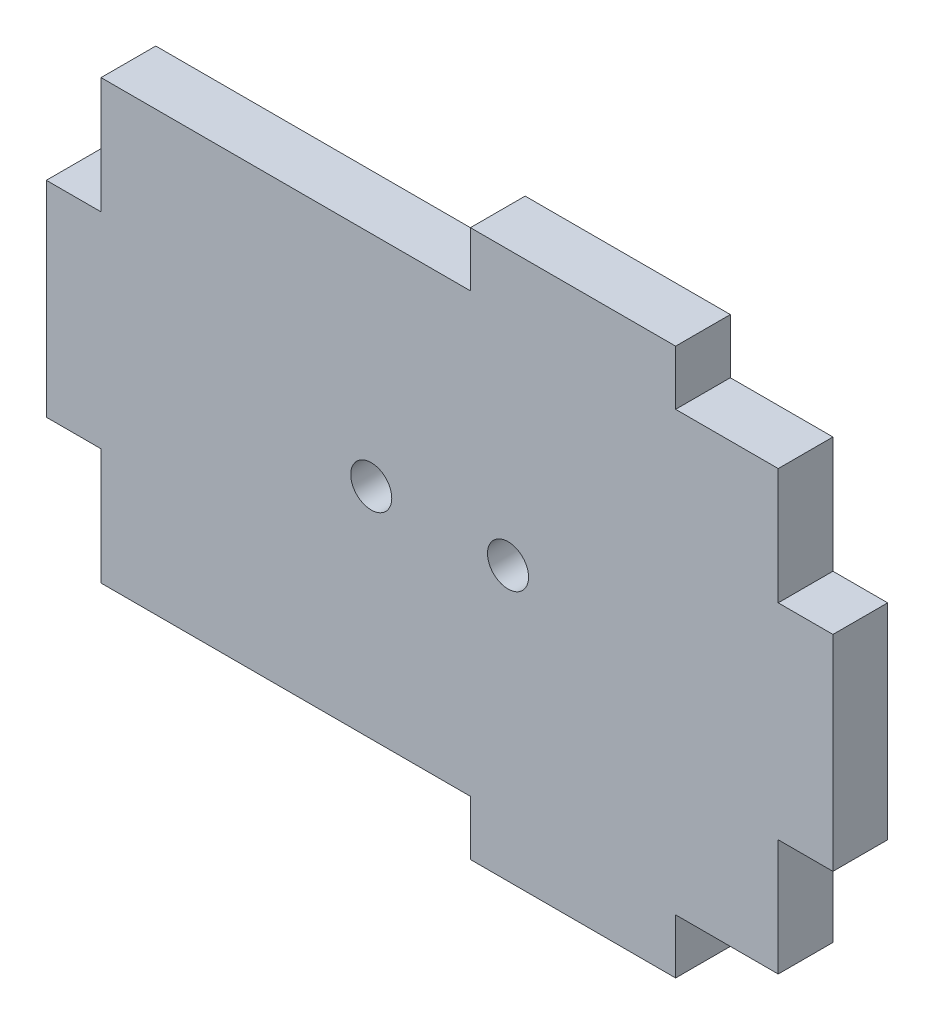
ISO-10303-21;
HEADER;
FILE_DESCRIPTION(('STEP AP214'),'2;1');
FILE_NAME('part.step','',(''),(''),'','','');
FILE_SCHEMA(('AUTOMOTIVE_DESIGN { 1 0 10303 214 1 1 1 1 }'));
ENDSEC;
DATA;
#1=APPLICATION_CONTEXT('core data for automotive mechanical design processes');
#2=APPLICATION_PROTOCOL_DEFINITION('international standard','automotive_design',2000,#1);
#3=PRODUCT_CONTEXT('',#1,'mechanical');
#4=PRODUCT('Part','Part','',(#3));
#5=PRODUCT_RELATED_PRODUCT_CATEGORY('part','',(#4));
#6=PRODUCT_DEFINITION_FORMATION('','',#4);
#7=PRODUCT_DEFINITION_CONTEXT('part definition',#1,'design');
#8=PRODUCT_DEFINITION('design','',#6,#7);
#9=PRODUCT_DEFINITION_SHAPE('','',#8);
#10=(LENGTH_UNIT() NAMED_UNIT(*) SI_UNIT(.MILLI.,.METRE.));
#11=(NAMED_UNIT(*) PLANE_ANGLE_UNIT() SI_UNIT($,.RADIAN.));
#12=(NAMED_UNIT(*) SI_UNIT($,.STERADIAN.) SOLID_ANGLE_UNIT());
#13=UNCERTAINTY_MEASURE_WITH_UNIT(LENGTH_MEASURE(1.E-05),#10,'distance_accuracy_value','');
#14=(GEOMETRIC_REPRESENTATION_CONTEXT(3) GLOBAL_UNCERTAINTY_ASSIGNED_CONTEXT((#13)) GLOBAL_UNIT_ASSIGNED_CONTEXT((#10,
#11,#12)) REPRESENTATION_CONTEXT('',''));
#15=CARTESIAN_POINT('',(0.,0.,0.));
#16=DIRECTION('',(0.,0.,1.));
#17=DIRECTION('',(1.,0.,0.));
#18=AXIS2_PLACEMENT_3D('',#15,#16,#17);
#19=CARTESIAN_POINT('',(0.,0.,4.));
#20=DIRECTION('',(0.,0.,1.));
#21=DIRECTION('',(1.,0.,0.));
#22=AXIS2_PLACEMENT_3D('',#19,#20,#21);
#23=PLANE('',#22);
#24=CARTESIAN_POINT('',(19.75,16.,4.));
#25=DIRECTION('',(0.,0.,1.));
#26=DIRECTION('',(1.,0.,0.));
#27=AXIS2_PLACEMENT_3D('',#24,#25,#26);
#28=CIRCLE('',#27,1.5);
#29=CARTESIAN_POINT('',(21.25,16.,4.));
#30=VERTEX_POINT('',#29);
#31=EDGE_CURVE('E303',#30,#30,#28,.T.);
#32=ORIENTED_EDGE('',*,*,#31,.F.);
#33=EDGE_LOOP('',(#32));
#34=FACE_BOUND('',#33,.T.);
#35=DIRECTION('',(0.,-1.,0.));
#36=VECTOR('',#35,1.);
#37=CARTESIAN_POINT('',(0.,0.,4.));
#38=LINE('',#37,#36);
#39=CARTESIAN_POINT('',(0.,8.5,4.));
#40=VERTEX_POINT('',#39);
#41=CARTESIAN_POINT('',(0.,0.,4.));
#42=VERTEX_POINT('',#41);
#43=EDGE_CURVE('E296',#40,#42,#38,.T.);
#44=ORIENTED_EDGE('',*,*,#43,.T.);
#45=DIRECTION('',(1.,0.,0.));
#46=VECTOR('',#45,1.);
#47=CARTESIAN_POINT('',(0.,0.,4.));
#48=LINE('',#47,#46);
#49=CARTESIAN_POINT('',(27.,0.,4.));
#50=VERTEX_POINT('',#49);
#51=EDGE_CURVE('E137',#42,#50,#48,.T.);
#52=ORIENTED_EDGE('',*,*,#51,.T.);
#53=DIRECTION('',(0.,-1.,0.));
#54=VECTOR('',#53,1.);
#55=CARTESIAN_POINT('',(27.,0.,4.));
#56=LINE('',#55,#54);
#57=CARTESIAN_POINT('',(27.,-4.,4.));
#58=VERTEX_POINT('',#57);
#59=EDGE_CURVE('E286',#50,#58,#56,.T.);
#60=ORIENTED_EDGE('',*,*,#59,.T.);
#61=DIRECTION('',(1.,0.,0.));
#62=VECTOR('',#61,1.);
#63=CARTESIAN_POINT('',(27.,-4.,4.));
#64=LINE('',#63,#62);
#65=CARTESIAN_POINT('',(42.,-4.,4.));
#66=VERTEX_POINT('',#65);
#67=EDGE_CURVE('E282',#58,#66,#64,.T.);
#68=ORIENTED_EDGE('',*,*,#67,.T.);
#69=DIRECTION('',(0.,1.,0.));
#70=VECTOR('',#69,1.);
#71=CARTESIAN_POINT('',(42.,-4.,4.));
#72=LINE('',#71,#70);
#73=CARTESIAN_POINT('',(42.,0.,4.));
#74=VERTEX_POINT('',#73);
#75=EDGE_CURVE('E279',#66,#74,#72,.T.);
#76=ORIENTED_EDGE('',*,*,#75,.T.);
#77=DIRECTION('',(1.,0.,0.));
#78=VECTOR('',#77,1.);
#79=CARTESIAN_POINT('',(42.,0.,4.));
#80=LINE('',#79,#78);
#81=CARTESIAN_POINT('',(49.5,0.,4.));
#82=VERTEX_POINT('',#81);
#83=EDGE_CURVE('E271',#74,#82,#80,.T.);
#84=ORIENTED_EDGE('',*,*,#83,.T.);
#85=DIRECTION('',(0.,1.,0.));
#86=VECTOR('',#85,1.);
#87=CARTESIAN_POINT('',(49.5,0.,4.));
#88=LINE('',#87,#86);
#89=CARTESIAN_POINT('',(49.5,8.5,4.));
#90=VERTEX_POINT('',#89);
#91=EDGE_CURVE('E267',#82,#90,#88,.T.);
#92=ORIENTED_EDGE('',*,*,#91,.T.);
#93=DIRECTION('',(1.,0.,0.));
#94=VECTOR('',#93,1.);
#95=CARTESIAN_POINT('',(49.5,8.5,4.));
#96=LINE('',#95,#94);
#97=CARTESIAN_POINT('',(53.5,8.5,4.));
#98=VERTEX_POINT('',#97);
#99=EDGE_CURVE('E263',#90,#98,#96,.T.);
#100=ORIENTED_EDGE('',*,*,#99,.T.);
#101=DIRECTION('',(0.,1.,0.));
#102=VECTOR('',#101,1.);
#103=CARTESIAN_POINT('',(53.5,23.5,4.));
#104=LINE('',#103,#102);
#105=CARTESIAN_POINT('',(53.5,23.5,4.));
#106=VERTEX_POINT('',#105);
#107=EDGE_CURVE('E260',#98,#106,#104,.T.);
#108=ORIENTED_EDGE('',*,*,#107,.T.);
#109=DIRECTION('',(-1.,0.,0.));
#110=VECTOR('',#109,1.);
#111=CARTESIAN_POINT('',(49.5,23.5,4.));
#112=LINE('',#111,#110);
#113=CARTESIAN_POINT('',(49.5,23.5,4.));
#114=VERTEX_POINT('',#113);
#115=EDGE_CURVE('E252',#106,#114,#112,.T.);
#116=ORIENTED_EDGE('',*,*,#115,.T.);
#117=DIRECTION('',(0.,1.,0.));
#118=VECTOR('',#117,1.);
#119=CARTESIAN_POINT('',(49.5,23.5,4.));
#120=LINE('',#119,#118);
#121=CARTESIAN_POINT('',(49.5,32.,4.));
#122=VERTEX_POINT('',#121);
#123=EDGE_CURVE('E248',#114,#122,#120,.T.);
#124=ORIENTED_EDGE('',*,*,#123,.T.);
#125=DIRECTION('',(-1.,0.,0.));
#126=VECTOR('',#125,1.);
#127=CARTESIAN_POINT('',(42.,32.,4.));
#128=LINE('',#127,#126);
#129=CARTESIAN_POINT('',(42.,32.,4.));
#130=VERTEX_POINT('',#129);
#131=EDGE_CURVE('E244',#122,#130,#128,.T.);
#132=ORIENTED_EDGE('',*,*,#131,.T.);
#133=DIRECTION('',(0.,1.,0.));
#134=VECTOR('',#133,1.);
#135=CARTESIAN_POINT('',(42.,36.,4.));
#136=LINE('',#135,#134);
#137=CARTESIAN_POINT('',(42.,36.,4.));
#138=VERTEX_POINT('',#137);
#139=EDGE_CURVE('E241',#130,#138,#136,.T.);
#140=ORIENTED_EDGE('',*,*,#139,.T.);
#141=DIRECTION('',(-1.,0.,0.));
#142=VECTOR('',#141,1.);
#143=CARTESIAN_POINT('',(27.,36.,4.));
#144=LINE('',#143,#142);
#145=CARTESIAN_POINT('',(27.,36.,4.));
#146=VERTEX_POINT('',#145);
#147=EDGE_CURVE('E233',#138,#146,#144,.T.);
#148=ORIENTED_EDGE('',*,*,#147,.T.);
#149=DIRECTION('',(0.,-1.,0.));
#150=VECTOR('',#149,1.);
#151=CARTESIAN_POINT('',(27.,32.,4.));
#152=LINE('',#151,#150);
#153=CARTESIAN_POINT('',(27.,32.,4.));
#154=VERTEX_POINT('',#153);
#155=EDGE_CURVE('E229',#146,#154,#152,.T.);
#156=ORIENTED_EDGE('',*,*,#155,.T.);
#157=DIRECTION('',(-1.,0.,0.));
#158=VECTOR('',#157,1.);
#159=CARTESIAN_POINT('',(0.,32.,4.));
#160=LINE('',#159,#158);
#161=CARTESIAN_POINT('',(0.,32.,4.));
#162=VERTEX_POINT('',#161);
#163=EDGE_CURVE('E225',#154,#162,#160,.T.);
#164=ORIENTED_EDGE('',*,*,#163,.T.);
#165=DIRECTION('',(0.,-1.,0.));
#166=VECTOR('',#165,1.);
#167=CARTESIAN_POINT('',(0.,23.5,4.));
#168=LINE('',#167,#166);
#169=CARTESIAN_POINT('',(0.,23.5,4.));
#170=VERTEX_POINT('',#169);
#171=EDGE_CURVE('E192',#162,#170,#168,.T.);
#172=ORIENTED_EDGE('',*,*,#171,.T.);
#173=DIRECTION('',(-1.,0.,0.));
#174=VECTOR('',#173,1.);
#175=CARTESIAN_POINT('',(0.,23.5,4.));
#176=LINE('',#175,#174);
#177=CARTESIAN_POINT('',(-4.,23.5,4.));
#178=VERTEX_POINT('',#177);
#179=EDGE_CURVE('E186',#170,#178,#176,.T.);
#180=ORIENTED_EDGE('',*,*,#179,.T.);
#181=DIRECTION('',(0.,-1.,0.));
#182=VECTOR('',#181,1.);
#183=CARTESIAN_POINT('',(-4.,23.5,4.));
#184=LINE('',#183,#182);
#185=CARTESIAN_POINT('',(-4.,8.5,4.));
#186=VERTEX_POINT('',#185);
#187=EDGE_CURVE('E190',#178,#186,#184,.T.);
#188=ORIENTED_EDGE('',*,*,#187,.T.);
#189=DIRECTION('',(1.,0.,0.));
#190=VECTOR('',#189,1.);
#191=CARTESIAN_POINT('',(0.,8.5,4.));
#192=LINE('',#191,#190);
#193=EDGE_CURVE('E58',#186,#40,#192,.T.);
#194=ORIENTED_EDGE('',*,*,#193,.T.);
#195=EDGE_LOOP('',(#44,#52,#60,#68,#76,#84,#92,#100,#108,#116,#124,#132,#140,#148,#156,#164,
#172,#180,#188,#194));
#196=FACE_BOUND('',#195,.T.);
#197=CARTESIAN_POINT('',(29.75,16.,4.));
#198=DIRECTION('',(0.,0.,1.));
#199=DIRECTION('',(-1.,0.,0.));
#200=AXIS2_PLACEMENT_3D('',#197,#198,#199);
#201=CIRCLE('',#200,1.5);
#202=CARTESIAN_POINT('',(28.25,16.,4.));
#203=VERTEX_POINT('',#202);
#204=EDGE_CURVE('E304',#203,#203,#201,.T.);
#205=ORIENTED_EDGE('',*,*,#204,.F.);
#206=EDGE_LOOP('',(#205));
#207=FACE_BOUND('',#206,.T.);
#208=ADVANCED_FACE('F40',(#34,#196,#207),#23,.T.);
#209=CARTESIAN_POINT('',(0.,0.,0.));
#210=DIRECTION('',(0.,0.,1.));
#211=DIRECTION('',(1.,0.,0.));
#212=AXIS2_PLACEMENT_3D('',#209,#210,#211);
#213=PLANE('',#212);
#214=DIRECTION('',(0.,-1.,0.));
#215=VECTOR('',#214,1.);
#216=CARTESIAN_POINT('',(0.,0.,0.));
#217=LINE('',#216,#215);
#218=CARTESIAN_POINT('',(0.,8.5,0.));
#219=VERTEX_POINT('',#218);
#220=CARTESIAN_POINT('',(0.,0.,0.));
#221=VERTEX_POINT('',#220);
#222=EDGE_CURVE('E309',#219,#221,#217,.T.);
#223=ORIENTED_EDGE('',*,*,#222,.F.);
#224=DIRECTION('',(1.,0.,0.));
#225=VECTOR('',#224,1.);
#226=CARTESIAN_POINT('',(0.,8.5,0.));
#227=LINE('',#226,#225);
#228=CARTESIAN_POINT('',(-4.,8.5,0.));
#229=VERTEX_POINT('',#228);
#230=EDGE_CURVE('E129',#229,#219,#227,.T.);
#231=ORIENTED_EDGE('',*,*,#230,.F.);
#232=DIRECTION('',(0.,-1.,0.));
#233=VECTOR('',#232,1.);
#234=CARTESIAN_POINT('',(-4.,23.5,0.));
#235=LINE('',#234,#233);
#236=CARTESIAN_POINT('',(-4.,23.5,0.));
#237=VERTEX_POINT('',#236);
#238=EDGE_CURVE('E123',#237,#229,#235,.T.);
#239=ORIENTED_EDGE('',*,*,#238,.F.);
#240=DIRECTION('',(-1.,0.,0.));
#241=VECTOR('',#240,1.);
#242=CARTESIAN_POINT('',(0.,23.5,0.));
#243=LINE('',#242,#241);
#244=CARTESIAN_POINT('',(0.,23.5,0.));
#245=VERTEX_POINT('',#244);
#246=EDGE_CURVE('E201',#245,#237,#243,.T.);
#247=ORIENTED_EDGE('',*,*,#246,.F.);
#248=DIRECTION('',(0.,-1.,0.));
#249=VECTOR('',#248,1.);
#250=CARTESIAN_POINT('',(0.,23.5,0.));
#251=LINE('',#250,#249);
#252=CARTESIAN_POINT('',(0.,32.,0.));
#253=VERTEX_POINT('',#252);
#254=EDGE_CURVE('E465',#253,#245,#251,.T.);
#255=ORIENTED_EDGE('',*,*,#254,.F.);
#256=DIRECTION('',(-1.,0.,0.));
#257=VECTOR('',#256,1.);
#258=CARTESIAN_POINT('',(0.,32.,0.));
#259=LINE('',#258,#257);
#260=CARTESIAN_POINT('',(27.,32.,0.));
#261=VERTEX_POINT('',#260);
#262=EDGE_CURVE('E462',#261,#253,#259,.T.);
#263=ORIENTED_EDGE('',*,*,#262,.F.);
#264=DIRECTION('',(0.,-1.,0.));
#265=VECTOR('',#264,1.);
#266=CARTESIAN_POINT('',(27.,32.,0.));
#267=LINE('',#266,#265);
#268=CARTESIAN_POINT('',(27.,36.,0.));
#269=VERTEX_POINT('',#268);
#270=EDGE_CURVE('E459',#269,#261,#267,.T.);
#271=ORIENTED_EDGE('',*,*,#270,.F.);
#272=DIRECTION('',(-1.,0.,0.));
#273=VECTOR('',#272,1.);
#274=CARTESIAN_POINT('',(27.,36.,0.));
#275=LINE('',#274,#273);
#276=CARTESIAN_POINT('',(42.,36.,0.));
#277=VERTEX_POINT('',#276);
#278=EDGE_CURVE('E456',#277,#269,#275,.T.);
#279=ORIENTED_EDGE('',*,*,#278,.F.);
#280=DIRECTION('',(0.,1.,0.));
#281=VECTOR('',#280,1.);
#282=CARTESIAN_POINT('',(42.,36.,0.));
#283=LINE('',#282,#281);
#284=CARTESIAN_POINT('',(42.,32.,0.));
#285=VERTEX_POINT('',#284);
#286=EDGE_CURVE('E453',#285,#277,#283,.T.);
#287=ORIENTED_EDGE('',*,*,#286,.F.);
#288=DIRECTION('',(-1.,0.,0.));
#289=VECTOR('',#288,1.);
#290=CARTESIAN_POINT('',(42.,32.,0.));
#291=LINE('',#290,#289);
#292=CARTESIAN_POINT('',(49.5,32.,0.));
#293=VERTEX_POINT('',#292);
#294=EDGE_CURVE('E450',#293,#285,#291,.T.);
#295=ORIENTED_EDGE('',*,*,#294,.F.);
#296=DIRECTION('',(0.,1.,0.));
#297=VECTOR('',#296,1.);
#298=CARTESIAN_POINT('',(49.5,23.5,0.));
#299=LINE('',#298,#297);
#300=CARTESIAN_POINT('',(49.5,23.5,0.));
#301=VERTEX_POINT('',#300);
#302=EDGE_CURVE('E447',#301,#293,#299,.T.);
#303=ORIENTED_EDGE('',*,*,#302,.F.);
#304=DIRECTION('',(-1.,0.,0.));
#305=VECTOR('',#304,1.);
#306=CARTESIAN_POINT('',(49.5,23.5,0.));
#307=LINE('',#306,#305);
#308=CARTESIAN_POINT('',(53.5,23.5,0.));
#309=VERTEX_POINT('',#308);
#310=EDGE_CURVE('E444',#309,#301,#307,.T.);
#311=ORIENTED_EDGE('',*,*,#310,.F.);
#312=DIRECTION('',(0.,1.,0.));
#313=VECTOR('',#312,1.);
#314=CARTESIAN_POINT('',(53.5,23.5,0.));
#315=LINE('',#314,#313);
#316=CARTESIAN_POINT('',(53.5,8.5,0.));
#317=VERTEX_POINT('',#316);
#318=EDGE_CURVE('E441',#317,#309,#315,.T.);
#319=ORIENTED_EDGE('',*,*,#318,.F.);
#320=DIRECTION('',(1.,0.,0.));
#321=VECTOR('',#320,1.);
#322=CARTESIAN_POINT('',(49.5,8.5,0.));
#323=LINE('',#322,#321);
#324=CARTESIAN_POINT('',(49.5,8.5,0.));
#325=VERTEX_POINT('',#324);
#326=EDGE_CURVE('E438',#325,#317,#323,.T.);
#327=ORIENTED_EDGE('',*,*,#326,.F.);
#328=DIRECTION('',(0.,1.,0.));
#329=VECTOR('',#328,1.);
#330=CARTESIAN_POINT('',(49.5,0.,0.));
#331=LINE('',#330,#329);
#332=CARTESIAN_POINT('',(49.5,0.,0.));
#333=VERTEX_POINT('',#332);
#334=EDGE_CURVE('E435',#333,#325,#331,.T.);
#335=ORIENTED_EDGE('',*,*,#334,.F.);
#336=DIRECTION('',(1.,0.,0.));
#337=VECTOR('',#336,1.);
#338=CARTESIAN_POINT('',(42.,0.,0.));
#339=LINE('',#338,#337);
#340=CARTESIAN_POINT('',(42.,0.,0.));
#341=VERTEX_POINT('',#340);
#342=EDGE_CURVE('E432',#341,#333,#339,.T.);
#343=ORIENTED_EDGE('',*,*,#342,.F.);
#344=DIRECTION('',(0.,1.,0.));
#345=VECTOR('',#344,1.);
#346=CARTESIAN_POINT('',(42.,-4.,0.));
#347=LINE('',#346,#345);
#348=CARTESIAN_POINT('',(42.,-4.,0.));
#349=VERTEX_POINT('',#348);
#350=EDGE_CURVE('E427',#349,#341,#347,.T.);
#351=ORIENTED_EDGE('',*,*,#350,.F.);
#352=DIRECTION('',(1.,0.,0.));
#353=VECTOR('',#352,1.);
#354=CARTESIAN_POINT('',(27.,-4.,0.));
#355=LINE('',#354,#353);
#356=CARTESIAN_POINT('',(27.,-4.,0.));
#357=VERTEX_POINT('',#356);
#358=EDGE_CURVE('E423',#357,#349,#355,.T.);
#359=ORIENTED_EDGE('',*,*,#358,.F.);
#360=DIRECTION('',(0.,-1.,0.));
#361=VECTOR('',#360,1.);
#362=CARTESIAN_POINT('',(27.,0.,0.));
#363=LINE('',#362,#361);
#364=CARTESIAN_POINT('',(27.,0.,0.));
#365=VERTEX_POINT('',#364);
#366=EDGE_CURVE('E414',#365,#357,#363,.T.);
#367=ORIENTED_EDGE('',*,*,#366,.F.);
#368=DIRECTION('',(1.,0.,0.));
#369=VECTOR('',#368,1.);
#370=CARTESIAN_POINT('',(0.,0.,0.));
#371=LINE('',#370,#369);
#372=EDGE_CURVE('E406',#221,#365,#371,.T.);
#373=ORIENTED_EDGE('',*,*,#372,.F.);
#374=EDGE_LOOP('',(#223,#231,#239,#247,#255,#263,#271,#279,#287,#295,#303,#311,#319,#327,#335,
#343,#351,#359,#367,#373));
#375=FACE_BOUND('',#374,.T.);
#376=CARTESIAN_POINT('',(19.75,16.,0.));
#377=DIRECTION('',(0.,0.,1.));
#378=DIRECTION('',(1.,0.,0.));
#379=AXIS2_PLACEMENT_3D('',#376,#377,#378);
#380=CIRCLE('',#379,1.5);
#381=CARTESIAN_POINT('',(21.25,16.,0.));
#382=VERTEX_POINT('',#381);
#383=EDGE_CURVE('E300',#382,#382,#380,.T.);
#384=ORIENTED_EDGE('',*,*,#383,.T.);
#385=EDGE_LOOP('',(#384));
#386=FACE_BOUND('',#385,.T.);
#387=CARTESIAN_POINT('',(29.75,16.,0.));
#388=DIRECTION('',(0.,0.,1.));
#389=DIRECTION('',(-1.,0.,0.));
#390=AXIS2_PLACEMENT_3D('',#387,#388,#389);
#391=CIRCLE('',#390,1.5);
#392=CARTESIAN_POINT('',(28.25,16.,0.));
#393=VERTEX_POINT('',#392);
#394=EDGE_CURVE('E310',#393,#393,#391,.T.);
#395=ORIENTED_EDGE('',*,*,#394,.T.);
#396=EDGE_LOOP('',(#395));
#397=FACE_BOUND('',#396,.T.);
#398=ADVANCED_FACE('F321',(#375,#386,#397),#213,.F.);
#399=CARTESIAN_POINT('',(0.,0.,4.));
#400=DIRECTION('',(1.,0.,0.));
#401=DIRECTION('',(0.,0.,-1.));
#402=AXIS2_PLACEMENT_3D('',#399,#400,#401);
#403=PLANE('',#402);
#404=ORIENTED_EDGE('',*,*,#222,.T.);
#405=DIRECTION('',(0.,0.,-1.));
#406=VECTOR('',#405,1.);
#407=CARTESIAN_POINT('',(0.,0.,4.));
#408=LINE('',#407,#406);
#409=EDGE_CURVE('E12',#42,#221,#408,.T.);
#410=ORIENTED_EDGE('',*,*,#409,.F.);
#411=ORIENTED_EDGE('',*,*,#43,.F.);
#412=DIRECTION('',(0.,0.,-1.));
#413=VECTOR('',#412,1.);
#414=CARTESIAN_POINT('',(0.,8.5,4.));
#415=LINE('',#414,#413);
#416=EDGE_CURVE('E210',#40,#219,#415,.T.);
#417=ORIENTED_EDGE('',*,*,#416,.T.);
#418=EDGE_LOOP('',(#404,#410,#411,#417));
#419=FACE_BOUND('',#418,.T.);
#420=ADVANCED_FACE('F42',(#419),#403,.F.);
#421=CARTESIAN_POINT('',(0.,0.,4.));
#422=DIRECTION('',(0.,1.,0.));
#423=DIRECTION('',(0.,0.,1.));
#424=AXIS2_PLACEMENT_3D('',#421,#422,#423);
#425=PLANE('',#424);
#426=ORIENTED_EDGE('',*,*,#372,.T.);
#427=DIRECTION('',(0.,0.,-1.));
#428=VECTOR('',#427,1.);
#429=CARTESIAN_POINT('',(27.,0.,4.));
#430=LINE('',#429,#428);
#431=EDGE_CURVE('E50',#50,#365,#430,.T.);
#432=ORIENTED_EDGE('',*,*,#431,.F.);
#433=ORIENTED_EDGE('',*,*,#51,.F.);
#434=ORIENTED_EDGE('',*,*,#409,.T.);
#435=EDGE_LOOP('',(#426,#432,#433,#434));
#436=FACE_BOUND('',#435,.T.);
#437=ADVANCED_FACE('F399',(#436),#425,.F.);
#438=CARTESIAN_POINT('',(27.,0.,4.));
#439=DIRECTION('',(1.,0.,0.));
#440=DIRECTION('',(0.,0.,-1.));
#441=AXIS2_PLACEMENT_3D('',#438,#439,#440);
#442=PLANE('',#441);
#443=ORIENTED_EDGE('',*,*,#366,.T.);
#444=DIRECTION('',(0.,0.,-1.));
#445=VECTOR('',#444,1.);
#446=CARTESIAN_POINT('',(27.,-4.,4.));
#447=LINE('',#446,#445);
#448=EDGE_CURVE('E419',#58,#357,#447,.T.);
#449=ORIENTED_EDGE('',*,*,#448,.F.);
#450=ORIENTED_EDGE('',*,*,#59,.F.);
#451=ORIENTED_EDGE('',*,*,#431,.T.);
#452=EDGE_LOOP('',(#443,#449,#450,#451));
#453=FACE_BOUND('',#452,.T.);
#454=ADVANCED_FACE('F396',(#453),#442,.F.);
#455=CARTESIAN_POINT('',(27.,-4.,4.));
#456=DIRECTION('',(0.,1.,0.));
#457=DIRECTION('',(0.,0.,1.));
#458=AXIS2_PLACEMENT_3D('',#455,#456,#457);
#459=PLANE('',#458);
#460=ORIENTED_EDGE('',*,*,#358,.T.);
#461=DIRECTION('',(0.,0.,-1.));
#462=VECTOR('',#461,1.);
#463=CARTESIAN_POINT('',(42.,-4.,4.));
#464=LINE('',#463,#462);
#465=EDGE_CURVE('E528',#66,#349,#464,.T.);
#466=ORIENTED_EDGE('',*,*,#465,.F.);
#467=ORIENTED_EDGE('',*,*,#67,.F.);
#468=ORIENTED_EDGE('',*,*,#448,.T.);
#469=EDGE_LOOP('',(#460,#466,#467,#468));
#470=FACE_BOUND('',#469,.T.);
#471=ADVANCED_FACE('F392',(#470),#459,.F.);
#472=CARTESIAN_POINT('',(42.,-4.,4.));
#473=DIRECTION('',(-1.,0.,0.));
#474=DIRECTION('',(0.,0.,1.));
#475=AXIS2_PLACEMENT_3D('',#472,#473,#474);
#476=PLANE('',#475);
#477=ORIENTED_EDGE('',*,*,#350,.T.);
#478=DIRECTION('',(0.,0.,-1.));
#479=VECTOR('',#478,1.);
#480=CARTESIAN_POINT('',(42.,0.,4.));
#481=LINE('',#480,#479);
#482=EDGE_CURVE('E524',#74,#341,#481,.T.);
#483=ORIENTED_EDGE('',*,*,#482,.F.);
#484=ORIENTED_EDGE('',*,*,#75,.F.);
#485=ORIENTED_EDGE('',*,*,#465,.T.);
#486=EDGE_LOOP('',(#477,#483,#484,#485));
#487=FACE_BOUND('',#486,.T.);
#488=ADVANCED_FACE('F388',(#487),#476,.F.);
#489=CARTESIAN_POINT('',(42.,0.,4.));
#490=DIRECTION('',(0.,1.,0.));
#491=DIRECTION('',(0.,0.,1.));
#492=AXIS2_PLACEMENT_3D('',#489,#490,#491);
#493=PLANE('',#492);
#494=ORIENTED_EDGE('',*,*,#342,.T.);
#495=DIRECTION('',(0.,0.,-1.));
#496=VECTOR('',#495,1.);
#497=CARTESIAN_POINT('',(49.5,0.,4.));
#498=LINE('',#497,#496);
#499=EDGE_CURVE('E520',#82,#333,#498,.T.);
#500=ORIENTED_EDGE('',*,*,#499,.F.);
#501=ORIENTED_EDGE('',*,*,#83,.F.);
#502=ORIENTED_EDGE('',*,*,#482,.T.);
#503=EDGE_LOOP('',(#494,#500,#501,#502));
#504=FACE_BOUND('',#503,.T.);
#505=ADVANCED_FACE('F384',(#504),#493,.F.);
#506=CARTESIAN_POINT('',(49.5,0.,4.));
#507=DIRECTION('',(-1.,0.,0.));
#508=DIRECTION('',(0.,0.,1.));
#509=AXIS2_PLACEMENT_3D('',#506,#507,#508);
#510=PLANE('',#509);
#511=ORIENTED_EDGE('',*,*,#334,.T.);
#512=DIRECTION('',(0.,0.,-1.));
#513=VECTOR('',#512,1.);
#514=CARTESIAN_POINT('',(49.5,8.5,4.));
#515=LINE('',#514,#513);
#516=EDGE_CURVE('E516',#90,#325,#515,.T.);
#517=ORIENTED_EDGE('',*,*,#516,.F.);
#518=ORIENTED_EDGE('',*,*,#91,.F.);
#519=ORIENTED_EDGE('',*,*,#499,.T.);
#520=EDGE_LOOP('',(#511,#517,#518,#519));
#521=FACE_BOUND('',#520,.T.);
#522=ADVANCED_FACE('F380',(#521),#510,.F.);
#523=CARTESIAN_POINT('',(49.5,8.5,4.));
#524=DIRECTION('',(0.,1.,0.));
#525=DIRECTION('',(0.,0.,1.));
#526=AXIS2_PLACEMENT_3D('',#523,#524,#525);
#527=PLANE('',#526);
#528=ORIENTED_EDGE('',*,*,#326,.T.);
#529=DIRECTION('',(0.,0.,-1.));
#530=VECTOR('',#529,1.);
#531=CARTESIAN_POINT('',(53.5,8.5,4.));
#532=LINE('',#531,#530);
#533=EDGE_CURVE('E512',#98,#317,#532,.T.);
#534=ORIENTED_EDGE('',*,*,#533,.F.);
#535=ORIENTED_EDGE('',*,*,#99,.F.);
#536=ORIENTED_EDGE('',*,*,#516,.T.);
#537=EDGE_LOOP('',(#528,#534,#535,#536));
#538=FACE_BOUND('',#537,.T.);
#539=ADVANCED_FACE('F376',(#538),#527,.F.);
#540=CARTESIAN_POINT('',(53.5,23.5,4.));
#541=DIRECTION('',(-1.,0.,0.));
#542=DIRECTION('',(0.,-1.,0.));
#543=AXIS2_PLACEMENT_3D('',#540,#541,#542);
#544=PLANE('',#543);
#545=ORIENTED_EDGE('',*,*,#318,.T.);
#546=DIRECTION('',(0.,0.,-1.));
#547=VECTOR('',#546,1.);
#548=CARTESIAN_POINT('',(53.5,23.5,4.));
#549=LINE('',#548,#547);
#550=EDGE_CURVE('E508',#106,#309,#549,.T.);
#551=ORIENTED_EDGE('',*,*,#550,.F.);
#552=ORIENTED_EDGE('',*,*,#107,.F.);
#553=ORIENTED_EDGE('',*,*,#533,.T.);
#554=EDGE_LOOP('',(#545,#551,#552,#553));
#555=FACE_BOUND('',#554,.T.);
#556=ADVANCED_FACE('F372',(#555),#544,.F.);
#557=CARTESIAN_POINT('',(49.5,23.5,4.));
#558=DIRECTION('',(0.,-1.,0.));
#559=DIRECTION('',(1.,0.,0.));
#560=AXIS2_PLACEMENT_3D('',#557,#558,#559);
#561=PLANE('',#560);
#562=ORIENTED_EDGE('',*,*,#310,.T.);
#563=DIRECTION('',(0.,0.,-1.));
#564=VECTOR('',#563,1.);
#565=CARTESIAN_POINT('',(49.5,23.5,4.));
#566=LINE('',#565,#564);
#567=EDGE_CURVE('E504',#114,#301,#566,.T.);
#568=ORIENTED_EDGE('',*,*,#567,.F.);
#569=ORIENTED_EDGE('',*,*,#115,.F.);
#570=ORIENTED_EDGE('',*,*,#550,.T.);
#571=EDGE_LOOP('',(#562,#568,#569,#570));
#572=FACE_BOUND('',#571,.T.);
#573=ADVANCED_FACE('F368',(#572),#561,.F.);
#574=CARTESIAN_POINT('',(49.5,23.5,4.));
#575=DIRECTION('',(-1.,0.,0.));
#576=DIRECTION('',(0.,0.,1.));
#577=AXIS2_PLACEMENT_3D('',#574,#575,#576);
#578=PLANE('',#577);
#579=ORIENTED_EDGE('',*,*,#302,.T.);
#580=DIRECTION('',(0.,0.,-1.));
#581=VECTOR('',#580,1.);
#582=CARTESIAN_POINT('',(49.5,32.,4.));
#583=LINE('',#582,#581);
#584=EDGE_CURVE('E500',#122,#293,#583,.T.);
#585=ORIENTED_EDGE('',*,*,#584,.F.);
#586=ORIENTED_EDGE('',*,*,#123,.F.);
#587=ORIENTED_EDGE('',*,*,#567,.T.);
#588=EDGE_LOOP('',(#579,#585,#586,#587));
#589=FACE_BOUND('',#588,.T.);
#590=ADVANCED_FACE('F364',(#589),#578,.F.);
#591=CARTESIAN_POINT('',(42.,32.,4.));
#592=DIRECTION('',(0.,-1.,0.));
#593=DIRECTION('',(0.,0.,-1.));
#594=AXIS2_PLACEMENT_3D('',#591,#592,#593);
#595=PLANE('',#594);
#596=ORIENTED_EDGE('',*,*,#294,.T.);
#597=DIRECTION('',(0.,0.,-1.));
#598=VECTOR('',#597,1.);
#599=CARTESIAN_POINT('',(42.,32.,4.));
#600=LINE('',#599,#598);
#601=EDGE_CURVE('E496',#130,#285,#600,.T.);
#602=ORIENTED_EDGE('',*,*,#601,.F.);
#603=ORIENTED_EDGE('',*,*,#131,.F.);
#604=ORIENTED_EDGE('',*,*,#584,.T.);
#605=EDGE_LOOP('',(#596,#602,#603,#604));
#606=FACE_BOUND('',#605,.T.);
#607=ADVANCED_FACE('F360',(#606),#595,.F.);
#608=CARTESIAN_POINT('',(42.,36.,4.));
#609=DIRECTION('',(-1.,0.,0.));
#610=DIRECTION('',(0.,0.,1.));
#611=AXIS2_PLACEMENT_3D('',#608,#609,#610);
#612=PLANE('',#611);
#613=ORIENTED_EDGE('',*,*,#286,.T.);
#614=DIRECTION('',(0.,0.,-1.));
#615=VECTOR('',#614,1.);
#616=CARTESIAN_POINT('',(42.,36.,4.));
#617=LINE('',#616,#615);
#618=EDGE_CURVE('E492',#138,#277,#617,.T.);
#619=ORIENTED_EDGE('',*,*,#618,.F.);
#620=ORIENTED_EDGE('',*,*,#139,.F.);
#621=ORIENTED_EDGE('',*,*,#601,.T.);
#622=EDGE_LOOP('',(#613,#619,#620,#621));
#623=FACE_BOUND('',#622,.T.);
#624=ADVANCED_FACE('F356',(#623),#612,.F.);
#625=CARTESIAN_POINT('',(27.,36.,4.));
#626=DIRECTION('',(0.,-1.,0.));
#627=DIRECTION('',(0.,0.,-1.));
#628=AXIS2_PLACEMENT_3D('',#625,#626,#627);
#629=PLANE('',#628);
#630=ORIENTED_EDGE('',*,*,#278,.T.);
#631=DIRECTION('',(0.,0.,-1.));
#632=VECTOR('',#631,1.);
#633=CARTESIAN_POINT('',(27.,36.,4.));
#634=LINE('',#633,#632);
#635=EDGE_CURVE('E488',#146,#269,#634,.T.);
#636=ORIENTED_EDGE('',*,*,#635,.F.);
#637=ORIENTED_EDGE('',*,*,#147,.F.);
#638=ORIENTED_EDGE('',*,*,#618,.T.);
#639=EDGE_LOOP('',(#630,#636,#637,#638));
#640=FACE_BOUND('',#639,.T.);
#641=ADVANCED_FACE('F352',(#640),#629,.F.);
#642=CARTESIAN_POINT('',(27.,32.,4.));
#643=DIRECTION('',(1.,0.,0.));
#644=DIRECTION('',(0.,0.,-1.));
#645=AXIS2_PLACEMENT_3D('',#642,#643,#644);
#646=PLANE('',#645);
#647=ORIENTED_EDGE('',*,*,#270,.T.);
#648=DIRECTION('',(0.,0.,-1.));
#649=VECTOR('',#648,1.);
#650=CARTESIAN_POINT('',(27.,32.,4.));
#651=LINE('',#650,#649);
#652=EDGE_CURVE('E484',#154,#261,#651,.T.);
#653=ORIENTED_EDGE('',*,*,#652,.F.);
#654=ORIENTED_EDGE('',*,*,#155,.F.);
#655=ORIENTED_EDGE('',*,*,#635,.T.);
#656=EDGE_LOOP('',(#647,#653,#654,#655));
#657=FACE_BOUND('',#656,.T.);
#658=ADVANCED_FACE('F348',(#657),#646,.F.);
#659=CARTESIAN_POINT('',(0.,32.,4.));
#660=DIRECTION('',(0.,-1.,0.));
#661=DIRECTION('',(0.,0.,-1.));
#662=AXIS2_PLACEMENT_3D('',#659,#660,#661);
#663=PLANE('',#662);
#664=ORIENTED_EDGE('',*,*,#262,.T.);
#665=DIRECTION('',(0.,0.,-1.));
#666=VECTOR('',#665,1.);
#667=CARTESIAN_POINT('',(0.,32.,4.));
#668=LINE('',#667,#666);
#669=EDGE_CURVE('E480',#162,#253,#668,.T.);
#670=ORIENTED_EDGE('',*,*,#669,.F.);
#671=ORIENTED_EDGE('',*,*,#163,.F.);
#672=ORIENTED_EDGE('',*,*,#652,.T.);
#673=EDGE_LOOP('',(#664,#670,#671,#672));
#674=FACE_BOUND('',#673,.T.);
#675=ADVANCED_FACE('F344',(#674),#663,.F.);
#676=CARTESIAN_POINT('',(0.,23.5,4.));
#677=DIRECTION('',(1.,0.,0.));
#678=DIRECTION('',(0.,0.,-1.));
#679=AXIS2_PLACEMENT_3D('',#676,#677,#678);
#680=PLANE('',#679);
#681=ORIENTED_EDGE('',*,*,#254,.T.);
#682=DIRECTION('',(0.,0.,-1.));
#683=VECTOR('',#682,1.);
#684=CARTESIAN_POINT('',(0.,23.5,4.));
#685=LINE('',#684,#683);
#686=EDGE_CURVE('E203',#170,#245,#685,.T.);
#687=ORIENTED_EDGE('',*,*,#686,.F.);
#688=ORIENTED_EDGE('',*,*,#171,.F.);
#689=ORIENTED_EDGE('',*,*,#669,.T.);
#690=EDGE_LOOP('',(#681,#687,#688,#689));
#691=FACE_BOUND('',#690,.T.);
#692=ADVANCED_FACE('F341',(#691),#680,.F.);
#693=CARTESIAN_POINT('',(0.,23.5,4.));
#694=DIRECTION('',(0.,-1.,0.));
#695=DIRECTION('',(0.,0.,-1.));
#696=AXIS2_PLACEMENT_3D('',#693,#694,#695);
#697=PLANE('',#696);
#698=ORIENTED_EDGE('',*,*,#246,.T.);
#699=DIRECTION('',(0.,0.,-1.));
#700=VECTOR('',#699,1.);
#701=CARTESIAN_POINT('',(-4.,23.5,4.));
#702=LINE('',#701,#700);
#703=EDGE_CURVE('E198',#178,#237,#702,.T.);
#704=ORIENTED_EDGE('',*,*,#703,.F.);
#705=ORIENTED_EDGE('',*,*,#179,.F.);
#706=ORIENTED_EDGE('',*,*,#686,.T.);
#707=EDGE_LOOP('',(#698,#704,#705,#706));
#708=FACE_BOUND('',#707,.T.);
#709=ADVANCED_FACE('F199',(#708),#697,.F.);
#710=CARTESIAN_POINT('',(-4.,23.5,4.));
#711=DIRECTION('',(1.,0.,0.));
#712=DIRECTION('',(0.,0.,-1.));
#713=AXIS2_PLACEMENT_3D('',#710,#711,#712);
#714=PLANE('',#713);
#715=ORIENTED_EDGE('',*,*,#238,.T.);
#716=DIRECTION('',(0.,0.,-1.));
#717=VECTOR('',#716,1.);
#718=CARTESIAN_POINT('',(-4.,8.5,4.));
#719=LINE('',#718,#717);
#720=EDGE_CURVE('E204',#186,#229,#719,.T.);
#721=ORIENTED_EDGE('',*,*,#720,.F.);
#722=ORIENTED_EDGE('',*,*,#187,.F.);
#723=ORIENTED_EDGE('',*,*,#703,.T.);
#724=EDGE_LOOP('',(#715,#721,#722,#723));
#725=FACE_BOUND('',#724,.T.);
#726=ADVANCED_FACE('F206',(#725),#714,.F.);
#727=CARTESIAN_POINT('',(0.,8.5,4.));
#728=DIRECTION('',(0.,1.,0.));
#729=DIRECTION('',(0.,0.,1.));
#730=AXIS2_PLACEMENT_3D('',#727,#728,#729);
#731=PLANE('',#730);
#732=ORIENTED_EDGE('',*,*,#230,.T.);
#733=ORIENTED_EDGE('',*,*,#416,.F.);
#734=ORIENTED_EDGE('',*,*,#193,.F.);
#735=ORIENTED_EDGE('',*,*,#720,.T.);
#736=EDGE_LOOP('',(#732,#733,#734,#735));
#737=FACE_BOUND('',#736,.T.);
#738=ADVANCED_FACE('F334',(#737),#731,.F.);
#739=CARTESIAN_POINT('',(19.75,16.,4.));
#740=DIRECTION('',(0.,0.,-1.));
#741=DIRECTION('',(-1.,0.,0.));
#742=AXIS2_PLACEMENT_3D('',#739,#740,#741);
#743=CYLINDRICAL_SURFACE('',#742,1.5);
#744=ORIENTED_EDGE('',*,*,#31,.T.);
#745=EDGE_LOOP('',(#744));
#746=FACE_BOUND('',#745,.T.);
#747=ORIENTED_EDGE('',*,*,#383,.F.);
#748=EDGE_LOOP('',(#747));
#749=FACE_BOUND('',#748,.T.);
#750=ADVANCED_FACE('F331',(#746,#749),#743,.F.);
#751=CARTESIAN_POINT('',(29.75,16.,4.));
#752=DIRECTION('',(0.,0.,-1.));
#753=DIRECTION('',(-1.,0.,0.));
#754=AXIS2_PLACEMENT_3D('',#751,#752,#753);
#755=CYLINDRICAL_SURFACE('',#754,1.5);
#756=ORIENTED_EDGE('',*,*,#204,.T.);
#757=EDGE_LOOP('',(#756));
#758=FACE_BOUND('',#757,.T.);
#759=ORIENTED_EDGE('',*,*,#394,.F.);
#760=EDGE_LOOP('',(#759));
#761=FACE_BOUND('',#760,.T.);
#762=ADVANCED_FACE('F318',(#758,#761),#755,.F.);
#763=CLOSED_SHELL('',(#208,#398,#420,#437,#454,#471,#488,#505,#522,#539,#556,#573,#590,#607,
#624,#641,#658,#675,#692,#709,#726,#738,#750,#762));
#764=MANIFOLD_SOLID_BREP('B2',#763);
#765=ADVANCED_BREP_SHAPE_REPRESENTATION('',(#18,#764),#14);
#766=SHAPE_DEFINITION_REPRESENTATION(#9,#765);
ENDSEC;
END-ISO-10303-21;
